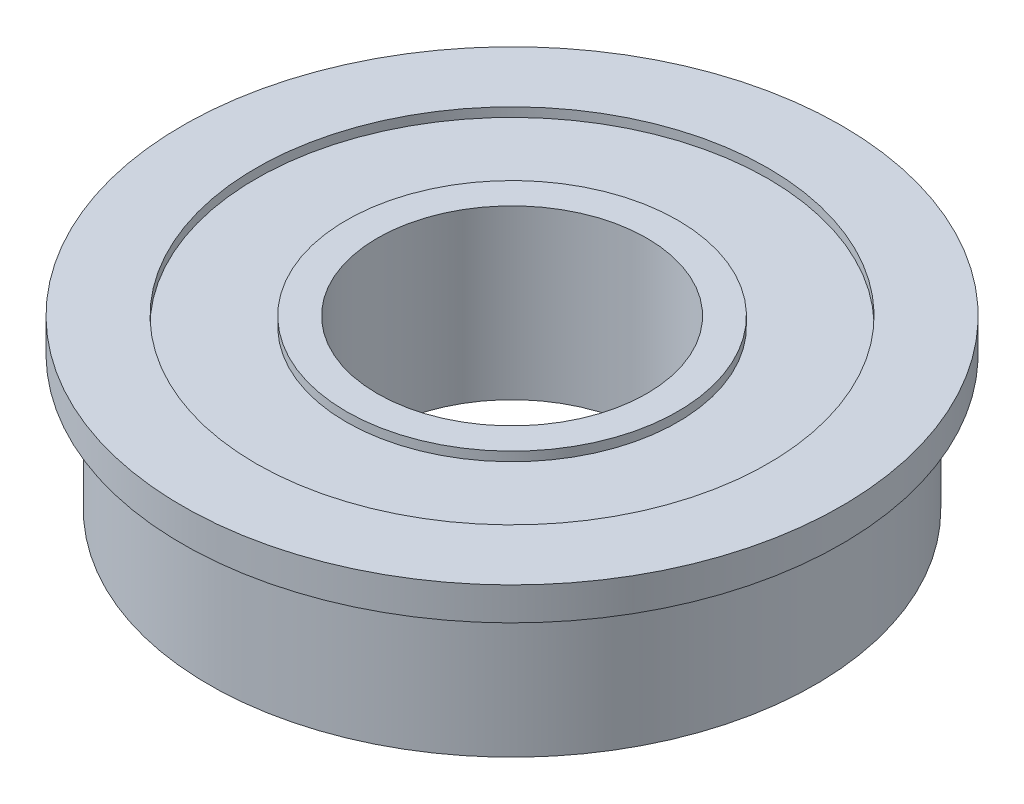
ISO-10303-21;
HEADER;
FILE_DESCRIPTION(('STEP AP214'),'2;1');
FILE_NAME('part.step','',(''),(''),'','','');
FILE_SCHEMA(('AUTOMOTIVE_DESIGN { 1 0 10303 214 1 1 1 1 }'));
ENDSEC;
DATA;
#1=APPLICATION_CONTEXT('core data for automotive mechanical design processes');
#2=APPLICATION_PROTOCOL_DEFINITION('international standard','automotive_design',2000,#1);
#3=PRODUCT_CONTEXT('',#1,'mechanical');
#4=PRODUCT('Part','Part','',(#3));
#5=PRODUCT_RELATED_PRODUCT_CATEGORY('part','',(#4));
#6=PRODUCT_DEFINITION_FORMATION('','',#4);
#7=PRODUCT_DEFINITION_CONTEXT('part definition',#1,'design');
#8=PRODUCT_DEFINITION('design','',#6,#7);
#9=PRODUCT_DEFINITION_SHAPE('','',#8);
#10=(LENGTH_UNIT() NAMED_UNIT(*) SI_UNIT(.MILLI.,.METRE.));
#11=(NAMED_UNIT(*) PLANE_ANGLE_UNIT() SI_UNIT($,.RADIAN.));
#12=(NAMED_UNIT(*) SI_UNIT($,.STERADIAN.) SOLID_ANGLE_UNIT());
#13=UNCERTAINTY_MEASURE_WITH_UNIT(LENGTH_MEASURE(1.E-05),#10,'distance_accuracy_value','');
#14=(GEOMETRIC_REPRESENTATION_CONTEXT(3) GLOBAL_UNCERTAINTY_ASSIGNED_CONTEXT((#13)) GLOBAL_UNIT_ASSIGNED_CONTEXT((#10,
#11,#12)) REPRESENTATION_CONTEXT('',''));
#15=CARTESIAN_POINT('',(0.,0.,0.));
#16=DIRECTION('',(0.,0.,1.));
#17=DIRECTION('',(1.,0.,0.));
#18=AXIS2_PLACEMENT_3D('',#15,#16,#17);
#19=CARTESIAN_POINT('',(0.,7.4803,0.));
#20=DIRECTION('',(0.,1.,0.));
#21=DIRECTION('',(0.,0.,1.));
#22=AXIS2_PLACEMENT_3D('',#19,#20,#21);
#23=CYLINDRICAL_SURFACE('',#22,12.065);
#24=CARTESIAN_POINT('',(0.,7.9121,0.));
#25=DIRECTION('',(0.,1.,0.));
#26=DIRECTION('',(0.,0.,1.));
#27=AXIS2_PLACEMENT_3D('',#24,#25,#26);
#28=CIRCLE('',#27,12.065);
#29=CARTESIAN_POINT('',(0.,7.9121,12.065));
#30=VERTEX_POINT('',#29);
#31=EDGE_CURVE('E18',#30,#30,#28,.F.);
#32=ORIENTED_EDGE('',*,*,#31,.F.);
#33=EDGE_LOOP('',(#32));
#34=FACE_BOUND('',#33,.T.);
#35=CARTESIAN_POINT('',(0.,7.4803,0.));
#36=DIRECTION('',(0.,1.,0.));
#37=DIRECTION('',(0.,0.,1.));
#38=AXIS2_PLACEMENT_3D('',#35,#36,#37);
#39=CIRCLE('',#38,12.065);
#40=CARTESIAN_POINT('',(0.,7.4803,12.065));
#41=VERTEX_POINT('',#40);
#42=EDGE_CURVE('E46',#41,#41,#39,.T.);
#43=ORIENTED_EDGE('',*,*,#42,.F.);
#44=EDGE_LOOP('',(#43));
#45=FACE_BOUND('',#44,.T.);
#46=ADVANCED_FACE('F15',(#34,#45),#23,.F.);
#47=CARTESIAN_POINT('',(0.,7.9121,0.));
#48=DIRECTION('',(0.,1.,0.));
#49=DIRECTION('',(0.,0.,1.));
#50=AXIS2_PLACEMENT_3D('',#47,#48,#49);
#51=PLANE('',#50);
#52=CARTESIAN_POINT('',(0.,7.9121,0.));
#53=DIRECTION('',(0.,-1.,0.));
#54=DIRECTION('',(0.,0.,-1.));
#55=AXIS2_PLACEMENT_3D('',#52,#53,#54);
#56=CIRCLE('',#55,15.5321);
#57=CARTESIAN_POINT('',(0.,7.9121,-15.5321));
#58=VERTEX_POINT('',#57);
#59=EDGE_CURVE('E44',#58,#58,#56,.T.);
#60=ORIENTED_EDGE('',*,*,#59,.F.);
#61=EDGE_LOOP('',(#60));
#62=FACE_BOUND('',#61,.T.);
#63=ORIENTED_EDGE('',*,*,#31,.T.);
#64=EDGE_LOOP('',(#63));
#65=FACE_BOUND('',#64,.T.);
#66=ADVANCED_FACE('F53',(#62,#65),#51,.T.);
#67=CARTESIAN_POINT('',(0.,7.4803,0.));
#68=DIRECTION('',(0.,1.,0.));
#69=DIRECTION('',(0.,0.,1.));
#70=AXIS2_PLACEMENT_3D('',#67,#68,#69);
#71=PLANE('',#70);
#72=ORIENTED_EDGE('',*,*,#42,.T.);
#73=EDGE_LOOP('',(#72));
#74=FACE_BOUND('',#73,.T.);
#75=CARTESIAN_POINT('',(0.,7.4803,0.));
#76=DIRECTION('',(0.,1.,0.));
#77=DIRECTION('',(0.,0.,1.));
#78=AXIS2_PLACEMENT_3D('',#75,#76,#77);
#79=CIRCLE('',#78,7.8105);
#80=CARTESIAN_POINT('',(0.,7.4803,7.8105));
#81=VERTEX_POINT('',#80);
#82=EDGE_CURVE('E41',#81,#81,#79,.T.);
#83=ORIENTED_EDGE('',*,*,#82,.F.);
#84=EDGE_LOOP('',(#83));
#85=FACE_BOUND('',#84,.T.);
#86=ADVANCED_FACE('F61',(#74,#85),#71,.T.);
#87=CARTESIAN_POINT('',(0.,7.9121,0.));
#88=DIRECTION('',(0.,-1.,0.));
#89=DIRECTION('',(0.,0.,-1.));
#90=AXIS2_PLACEMENT_3D('',#87,#88,#89);
#91=CYLINDRICAL_SURFACE('',#90,15.5321);
#92=ORIENTED_EDGE('',*,*,#59,.T.);
#93=EDGE_LOOP('',(#92));
#94=FACE_BOUND('',#93,.T.);
#95=CARTESIAN_POINT('',(0.,6.3627,0.));
#96=DIRECTION('',(0.,-1.,0.));
#97=DIRECTION('',(0.,0.,-1.));
#98=AXIS2_PLACEMENT_3D('',#95,#96,#97);
#99=CIRCLE('',#98,15.5321);
#100=CARTESIAN_POINT('',(0.,6.3627,-15.5321));
#101=VERTEX_POINT('',#100);
#102=EDGE_CURVE('E38',#101,#101,#99,.F.);
#103=ORIENTED_EDGE('',*,*,#102,.T.);
#104=EDGE_LOOP('',(#103));
#105=FACE_BOUND('',#104,.T.);
#106=ADVANCED_FACE('F89',(#94,#105),#91,.T.);
#107=CARTESIAN_POINT('',(0.,7.4803,0.));
#108=DIRECTION('',(0.,1.,0.));
#109=DIRECTION('',(0.,0.,1.));
#110=AXIS2_PLACEMENT_3D('',#107,#108,#109);
#111=CYLINDRICAL_SURFACE('',#110,7.8105);
#112=ORIENTED_EDGE('',*,*,#82,.T.);
#113=EDGE_LOOP('',(#112));
#114=FACE_BOUND('',#113,.T.);
#115=CARTESIAN_POINT('',(0.,7.9121,0.));
#116=DIRECTION('',(0.,1.,0.));
#117=DIRECTION('',(0.,0.,1.));
#118=AXIS2_PLACEMENT_3D('',#115,#116,#117);
#119=CIRCLE('',#118,7.8105);
#120=CARTESIAN_POINT('',(0.,7.9121,7.8105));
#121=VERTEX_POINT('',#120);
#122=EDGE_CURVE('E35',#121,#121,#119,.T.);
#123=ORIENTED_EDGE('',*,*,#122,.F.);
#124=EDGE_LOOP('',(#123));
#125=FACE_BOUND('',#124,.T.);
#126=ADVANCED_FACE('F85',(#114,#125),#111,.T.);
#127=CARTESIAN_POINT('',(0.,6.3627,0.));
#128=DIRECTION('',(0.,1.,0.));
#129=DIRECTION('',(0.,0.,1.));
#130=AXIS2_PLACEMENT_3D('',#127,#128,#129);
#131=PLANE('',#130);
#132=CARTESIAN_POINT('',(0.,6.3627,0.));
#133=DIRECTION('',(0.,-1.,0.));
#134=DIRECTION('',(0.,0.,-1.));
#135=AXIS2_PLACEMENT_3D('',#132,#133,#134);
#136=CIRCLE('',#135,14.2875);
#137=CARTESIAN_POINT('',(0.,6.3627,-14.2875));
#138=VERTEX_POINT('',#137);
#139=EDGE_CURVE('E32',#138,#138,#136,.T.);
#140=ORIENTED_EDGE('',*,*,#139,.F.);
#141=EDGE_LOOP('',(#140));
#142=FACE_BOUND('',#141,.T.);
#143=ORIENTED_EDGE('',*,*,#102,.F.);
#144=EDGE_LOOP('',(#143));
#145=FACE_BOUND('',#144,.T.);
#146=ADVANCED_FACE('F81',(#142,#145),#131,.F.);
#147=CARTESIAN_POINT('',(0.,7.9121,0.));
#148=DIRECTION('',(0.,1.,0.));
#149=DIRECTION('',(0.,0.,1.));
#150=AXIS2_PLACEMENT_3D('',#147,#148,#149);
#151=PLANE('',#150);
#152=ORIENTED_EDGE('',*,*,#122,.T.);
#153=EDGE_LOOP('',(#152));
#154=FACE_BOUND('',#153,.T.);
#155=CARTESIAN_POINT('',(0.,7.9121,0.));
#156=DIRECTION('',(0.,-1.,0.));
#157=DIRECTION('',(0.,0.,-1.));
#158=AXIS2_PLACEMENT_3D('',#155,#156,#157);
#159=CIRCLE('',#158,6.35);
#160=CARTESIAN_POINT('',(0.,7.9121,-6.35));
#161=VERTEX_POINT('',#160);
#162=EDGE_CURVE('E27',#161,#161,#159,.T.);
#163=ORIENTED_EDGE('',*,*,#162,.T.);
#164=EDGE_LOOP('',(#163));
#165=FACE_BOUND('',#164,.T.);
#166=ADVANCED_FACE('F77',(#154,#165),#151,.T.);
#167=CARTESIAN_POINT('',(0.,6.3627,0.));
#168=DIRECTION('',(0.,-1.,0.));
#169=DIRECTION('',(0.,0.,-1.));
#170=AXIS2_PLACEMENT_3D('',#167,#168,#169);
#171=CYLINDRICAL_SURFACE('',#170,14.2875);
#172=ORIENTED_EDGE('',*,*,#139,.T.);
#173=EDGE_LOOP('',(#172));
#174=FACE_BOUND('',#173,.T.);
#175=CARTESIAN_POINT('',(0.,0.,0.));
#176=DIRECTION('',(0.,-1.,0.));
#177=DIRECTION('',(0.,0.,-1.));
#178=AXIS2_PLACEMENT_3D('',#175,#176,#177);
#179=CIRCLE('',#178,14.2875);
#180=CARTESIAN_POINT('',(0.,0.,-14.2875));
#181=VERTEX_POINT('',#180);
#182=EDGE_CURVE('E22',#181,#181,#179,.F.);
#183=ORIENTED_EDGE('',*,*,#182,.T.);
#184=EDGE_LOOP('',(#183));
#185=FACE_BOUND('',#184,.T.);
#186=ADVANCED_FACE('F71',(#174,#185),#171,.T.);
#187=CARTESIAN_POINT('',(0.,6.3627,0.));
#188=DIRECTION('',(0.,-1.,0.));
#189=DIRECTION('',(0.,0.,-1.));
#190=AXIS2_PLACEMENT_3D('',#187,#188,#189);
#191=CYLINDRICAL_SURFACE('',#190,6.35);
#192=CARTESIAN_POINT('',(0.,0.,0.));
#193=DIRECTION('',(0.,-1.,0.));
#194=DIRECTION('',(0.,0.,-1.));
#195=AXIS2_PLACEMENT_3D('',#192,#193,#194);
#196=CIRCLE('',#195,6.35);
#197=CARTESIAN_POINT('',(0.,0.,-6.35));
#198=VERTEX_POINT('',#197);
#199=EDGE_CURVE('E10',#198,#198,#196,.T.);
#200=ORIENTED_EDGE('',*,*,#199,.T.);
#201=EDGE_LOOP('',(#200));
#202=FACE_BOUND('',#201,.T.);
#203=ORIENTED_EDGE('',*,*,#162,.F.);
#204=EDGE_LOOP('',(#203));
#205=FACE_BOUND('',#204,.T.);
#206=ADVANCED_FACE('F65',(#202,#205),#191,.F.);
#207=CARTESIAN_POINT('',(0.,0.,0.));
#208=DIRECTION('',(0.,1.,0.));
#209=DIRECTION('',(0.,0.,1.));
#210=AXIS2_PLACEMENT_3D('',#207,#208,#209);
#211=PLANE('',#210);
#212=ORIENTED_EDGE('',*,*,#199,.F.);
#213=EDGE_LOOP('',(#212));
#214=FACE_BOUND('',#213,.T.);
#215=ORIENTED_EDGE('',*,*,#182,.F.);
#216=EDGE_LOOP('',(#215));
#217=FACE_BOUND('',#216,.T.);
#218=ADVANCED_FACE('F63',(#214,#217),#211,.F.);
#219=CLOSED_SHELL('',(#46,#66,#86,#106,#126,#146,#166,#186,#206,#218));
#220=MANIFOLD_SOLID_BREP('B1',#219);
#221=ADVANCED_BREP_SHAPE_REPRESENTATION('',(#18,#220),#14);
#222=SHAPE_DEFINITION_REPRESENTATION(#9,#221);
ENDSEC;
END-ISO-10303-21;
